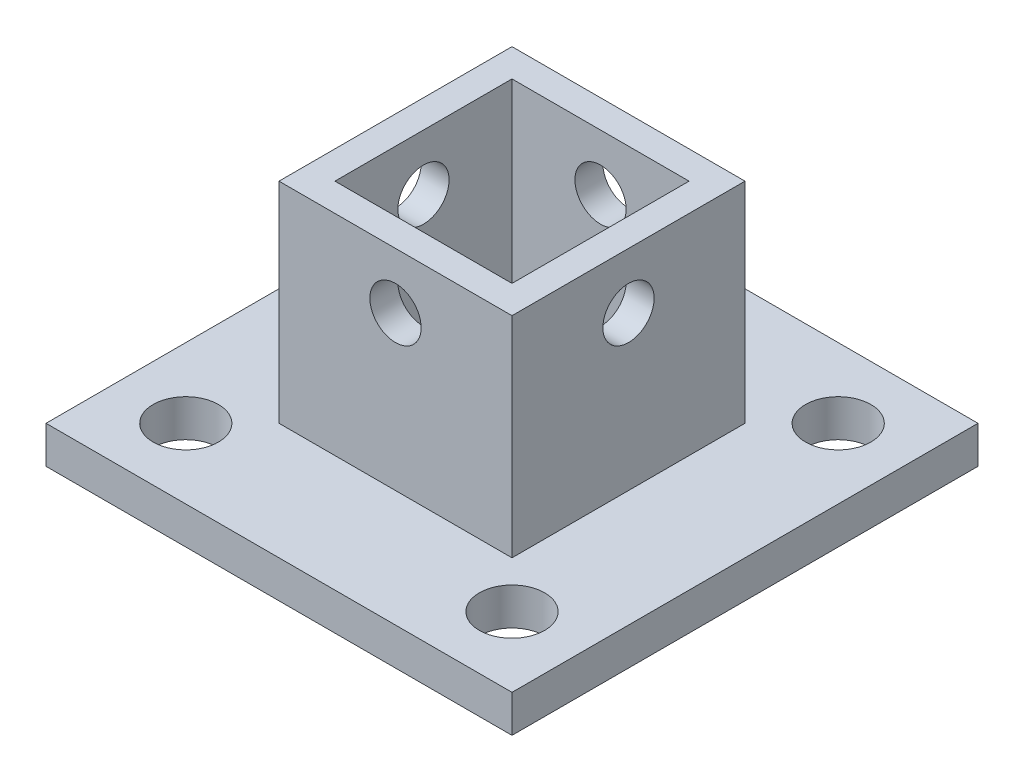
ISO-10303-21;
HEADER;
FILE_DESCRIPTION(('STEP AP214'),'2;1');
FILE_NAME('part.step','',(''),(''),'','','');
FILE_SCHEMA(('AUTOMOTIVE_DESIGN { 1 0 10303 214 1 1 1 1 }'));
ENDSEC;
DATA;
#1=APPLICATION_CONTEXT('core data for automotive mechanical design processes');
#2=APPLICATION_PROTOCOL_DEFINITION('international standard','automotive_design',2000,#1);
#3=PRODUCT_CONTEXT('',#1,'mechanical');
#4=PRODUCT('Part','Part','',(#3));
#5=PRODUCT_RELATED_PRODUCT_CATEGORY('part','',(#4));
#6=PRODUCT_DEFINITION_FORMATION('','',#4);
#7=PRODUCT_DEFINITION_CONTEXT('part definition',#1,'design');
#8=PRODUCT_DEFINITION('design','',#6,#7);
#9=PRODUCT_DEFINITION_SHAPE('','',#8);
#10=(LENGTH_UNIT() NAMED_UNIT(*) SI_UNIT(.MILLI.,.METRE.));
#11=(NAMED_UNIT(*) PLANE_ANGLE_UNIT() SI_UNIT($,.RADIAN.));
#12=(NAMED_UNIT(*) SI_UNIT($,.STERADIAN.) SOLID_ANGLE_UNIT());
#13=UNCERTAINTY_MEASURE_WITH_UNIT(LENGTH_MEASURE(1.E-05),#10,'distance_accuracy_value','');
#14=(GEOMETRIC_REPRESENTATION_CONTEXT(3) GLOBAL_UNCERTAINTY_ASSIGNED_CONTEXT((#13)) GLOBAL_UNIT_ASSIGNED_CONTEXT((#10,
#11,#12)) REPRESENTATION_CONTEXT('',''));
#15=CARTESIAN_POINT('',(0.,0.,0.));
#16=DIRECTION('',(0.,0.,1.));
#17=DIRECTION('',(1.,0.,0.));
#18=AXIS2_PLACEMENT_3D('',#15,#16,#17);
#19=CARTESIAN_POINT('',(0.,4.,0.));
#20=DIRECTION('',(0.,1.,0.));
#21=DIRECTION('',(0.,0.,1.));
#22=AXIS2_PLACEMENT_3D('',#19,#20,#21);
#23=PLANE('',#22);
#24=DIRECTION('',(0.,0.,1.));
#25=VECTOR('',#24,1.);
#26=CARTESIAN_POINT('',(25.,4.,0.));
#27=LINE('',#26,#25);
#28=CARTESIAN_POINT('',(25.,4.,-25.));
#29=VERTEX_POINT('',#28);
#30=CARTESIAN_POINT('',(25.,4.,25.));
#31=VERTEX_POINT('',#30);
#32=EDGE_CURVE('E214',#29,#31,#27,.T.);
#33=ORIENTED_EDGE('',*,*,#32,.F.);
#34=DIRECTION('',(1.,0.,0.));
#35=VECTOR('',#34,1.);
#36=CARTESIAN_POINT('',(0.,4.,-25.));
#37=LINE('',#36,#35);
#38=CARTESIAN_POINT('',(-25.,4.,-25.));
#39=VERTEX_POINT('',#38);
#40=EDGE_CURVE('E217',#39,#29,#37,.T.);
#41=ORIENTED_EDGE('',*,*,#40,.F.);
#42=DIRECTION('',(0.,0.,1.));
#43=VECTOR('',#42,1.);
#44=CARTESIAN_POINT('',(-25.,4.,0.));
#45=LINE('',#44,#43);
#46=CARTESIAN_POINT('',(-25.,4.,25.));
#47=VERTEX_POINT('',#46);
#48=EDGE_CURVE('E220',#39,#47,#45,.T.);
#49=ORIENTED_EDGE('',*,*,#48,.T.);
#50=DIRECTION('',(1.,0.,0.));
#51=VECTOR('',#50,1.);
#52=CARTESIAN_POINT('',(0.,4.,25.));
#53=LINE('',#52,#51);
#54=EDGE_CURVE('E223',#47,#31,#53,.T.);
#55=ORIENTED_EDGE('',*,*,#54,.T.);
#56=EDGE_LOOP('',(#33,#41,#49,#55));
#57=FACE_BOUND('',#56,.T.);
#58=CARTESIAN_POINT('',(-17.5,4.,-17.5));
#59=DIRECTION('',(0.,1.,0.));
#60=DIRECTION('',(0.,0.,1.));
#61=AXIS2_PLACEMENT_3D('',#58,#59,#60);
#62=CIRCLE('',#61,3.5);
#63=CARTESIAN_POINT('',(-17.5,4.,-14.));
#64=VERTEX_POINT('',#63);
#65=EDGE_CURVE('E211',#64,#64,#62,.T.);
#66=ORIENTED_EDGE('',*,*,#65,.F.);
#67=EDGE_LOOP('',(#66));
#68=FACE_BOUND('',#67,.T.);
#69=CARTESIAN_POINT('',(17.5,4.,-17.5));
#70=DIRECTION('',(0.,1.,0.));
#71=DIRECTION('',(0.,0.,1.));
#72=AXIS2_PLACEMENT_3D('',#69,#70,#71);
#73=CIRCLE('',#72,3.5);
#74=CARTESIAN_POINT('',(17.5,4.,-14.));
#75=VERTEX_POINT('',#74);
#76=EDGE_CURVE('E208',#75,#75,#73,.T.);
#77=ORIENTED_EDGE('',*,*,#76,.F.);
#78=EDGE_LOOP('',(#77));
#79=FACE_BOUND('',#78,.T.);
#80=CARTESIAN_POINT('',(17.5000000000004,4.,17.5));
#81=DIRECTION('',(0.,1.,0.));
#82=DIRECTION('',(0.,0.,1.));
#83=AXIS2_PLACEMENT_3D('',#80,#81,#82);
#84=CIRCLE('',#83,3.5);
#85=CARTESIAN_POINT('',(17.5000000000004,4.,21.));
#86=VERTEX_POINT('',#85);
#87=EDGE_CURVE('E204',#86,#86,#84,.T.);
#88=ORIENTED_EDGE('',*,*,#87,.F.);
#89=EDGE_LOOP('',(#88));
#90=FACE_BOUND('',#89,.T.);
#91=CARTESIAN_POINT('',(-17.4999999999996,4.,17.5));
#92=DIRECTION('',(0.,1.,0.));
#93=DIRECTION('',(0.,0.,1.));
#94=AXIS2_PLACEMENT_3D('',#91,#92,#93);
#95=CIRCLE('',#94,3.5);
#96=CARTESIAN_POINT('',(-17.4999999999996,4.,21.));
#97=VERTEX_POINT('',#96);
#98=EDGE_CURVE('E201',#97,#97,#95,.T.);
#99=ORIENTED_EDGE('',*,*,#98,.F.);
#100=EDGE_LOOP('',(#99));
#101=FACE_BOUND('',#100,.T.);
#102=DIRECTION('',(1.,0.,0.));
#103=VECTOR('',#102,1.);
#104=CARTESIAN_POINT('',(-12.5,4.,12.5));
#105=LINE('',#104,#103);
#106=CARTESIAN_POINT('',(-12.5,4.,12.5));
#107=VERTEX_POINT('',#106);
#108=CARTESIAN_POINT('',(12.5,4.,12.5));
#109=VERTEX_POINT('',#108);
#110=EDGE_CURVE('E187',#107,#109,#105,.T.);
#111=ORIENTED_EDGE('',*,*,#110,.F.);
#112=DIRECTION('',(0.,0.,1.));
#113=VECTOR('',#112,1.);
#114=CARTESIAN_POINT('',(-12.5,4.,-12.5));
#115=LINE('',#114,#113);
#116=CARTESIAN_POINT('',(-12.5,4.,-12.5));
#117=VERTEX_POINT('',#116);
#118=EDGE_CURVE('E150',#117,#107,#115,.T.);
#119=ORIENTED_EDGE('',*,*,#118,.F.);
#120=DIRECTION('',(-1.,0.,0.));
#121=VECTOR('',#120,1.);
#122=CARTESIAN_POINT('',(-12.5,4.,-12.5));
#123=LINE('',#122,#121);
#124=CARTESIAN_POINT('',(12.5,4.,-12.5));
#125=VERTEX_POINT('',#124);
#126=EDGE_CURVE('E178',#125,#117,#123,.T.);
#127=ORIENTED_EDGE('',*,*,#126,.F.);
#128=DIRECTION('',(0.,0.,-1.));
#129=VECTOR('',#128,1.);
#130=CARTESIAN_POINT('',(12.5,4.,-12.5));
#131=LINE('',#130,#129);
#132=EDGE_CURVE('E189',#109,#125,#131,.T.);
#133=ORIENTED_EDGE('',*,*,#132,.F.);
#134=EDGE_LOOP('',(#111,#119,#127,#133));
#135=FACE_BOUND('',#134,.T.);
#136=ADVANCED_FACE('F41',(#57,#68,#79,#90,#101,#135),#23,.T.);
#137=CARTESIAN_POINT('',(25.,4.,0.));
#138=DIRECTION('',(1.,0.,0.));
#139=DIRECTION('',(0.,0.,-1.));
#140=AXIS2_PLACEMENT_3D('',#137,#138,#139);
#141=PLANE('',#140);
#142=DIRECTION('',(0.,0.,1.));
#143=VECTOR('',#142,1.);
#144=CARTESIAN_POINT('',(25.,0.,0.));
#145=LINE('',#144,#143);
#146=CARTESIAN_POINT('',(25.,0.,-25.));
#147=VERTEX_POINT('',#146);
#148=CARTESIAN_POINT('',(25.,0.,25.));
#149=VERTEX_POINT('',#148);
#150=EDGE_CURVE('E237',#147,#149,#145,.T.);
#151=ORIENTED_EDGE('',*,*,#150,.F.);
#152=DIRECTION('',(0.,-1.,0.));
#153=VECTOR('',#152,1.);
#154=CARTESIAN_POINT('',(25.,4.,-25.));
#155=LINE('',#154,#153);
#156=EDGE_CURVE('E11',#29,#147,#155,.T.);
#157=ORIENTED_EDGE('',*,*,#156,.F.);
#158=ORIENTED_EDGE('',*,*,#32,.T.);
#159=DIRECTION('',(0.,-1.,0.));
#160=VECTOR('',#159,1.);
#161=CARTESIAN_POINT('',(25.,4.,25.));
#162=LINE('',#161,#160);
#163=EDGE_CURVE('E225',#31,#149,#162,.T.);
#164=ORIENTED_EDGE('',*,*,#163,.T.);
#165=EDGE_LOOP('',(#151,#157,#158,#164));
#166=FACE_BOUND('',#165,.T.);
#167=ADVANCED_FACE('F295',(#166),#141,.T.);
#168=CARTESIAN_POINT('',(0.,4.,-25.));
#169=DIRECTION('',(0.,0.,-1.));
#170=DIRECTION('',(-1.,0.,0.));
#171=AXIS2_PLACEMENT_3D('',#168,#169,#170);
#172=PLANE('',#171);
#173=DIRECTION('',(1.,0.,0.));
#174=VECTOR('',#173,1.);
#175=CARTESIAN_POINT('',(0.,0.,-25.));
#176=LINE('',#175,#174);
#177=CARTESIAN_POINT('',(-25.,0.,-25.));
#178=VERTEX_POINT('',#177);
#179=EDGE_CURVE('E240',#178,#147,#176,.T.);
#180=ORIENTED_EDGE('',*,*,#179,.F.);
#181=DIRECTION('',(0.,-1.,0.));
#182=VECTOR('',#181,1.);
#183=CARTESIAN_POINT('',(-25.,4.,-25.));
#184=LINE('',#183,#182);
#185=EDGE_CURVE('E50',#39,#178,#184,.T.);
#186=ORIENTED_EDGE('',*,*,#185,.F.);
#187=ORIENTED_EDGE('',*,*,#40,.T.);
#188=ORIENTED_EDGE('',*,*,#156,.T.);
#189=EDGE_LOOP('',(#180,#186,#187,#188));
#190=FACE_BOUND('',#189,.T.);
#191=ADVANCED_FACE('F303',(#190),#172,.T.);
#192=CARTESIAN_POINT('',(-25.,4.,0.));
#193=DIRECTION('',(1.,0.,0.));
#194=DIRECTION('',(0.,0.,-1.));
#195=AXIS2_PLACEMENT_3D('',#192,#193,#194);
#196=PLANE('',#195);
#197=DIRECTION('',(0.,0.,1.));
#198=VECTOR('',#197,1.);
#199=CARTESIAN_POINT('',(-25.,0.,0.));
#200=LINE('',#199,#198);
#201=CARTESIAN_POINT('',(-25.,0.,25.));
#202=VERTEX_POINT('',#201);
#203=EDGE_CURVE('E243',#178,#202,#200,.T.);
#204=ORIENTED_EDGE('',*,*,#203,.T.);
#205=DIRECTION('',(0.,-1.,0.));
#206=VECTOR('',#205,1.);
#207=CARTESIAN_POINT('',(-25.,4.,25.));
#208=LINE('',#207,#206);
#209=EDGE_CURVE('E249',#47,#202,#208,.T.);
#210=ORIENTED_EDGE('',*,*,#209,.F.);
#211=ORIENTED_EDGE('',*,*,#48,.F.);
#212=ORIENTED_EDGE('',*,*,#185,.T.);
#213=EDGE_LOOP('',(#204,#210,#211,#212));
#214=FACE_BOUND('',#213,.T.);
#215=ADVANCED_FACE('F487',(#214),#196,.F.);
#216=CARTESIAN_POINT('',(-17.5,4.,-17.5));
#217=DIRECTION('',(0.,-1.,0.));
#218=DIRECTION('',(0.,0.,-1.));
#219=AXIS2_PLACEMENT_3D('',#216,#217,#218);
#220=CYLINDRICAL_SURFACE('',#219,3.5);
#221=ORIENTED_EDGE('',*,*,#65,.T.);
#222=EDGE_LOOP('',(#221));
#223=FACE_BOUND('',#222,.T.);
#224=CARTESIAN_POINT('',(-17.5,0.,-17.5));
#225=DIRECTION('',(0.,1.,0.));
#226=DIRECTION('',(0.,0.,1.));
#227=AXIS2_PLACEMENT_3D('',#224,#225,#226);
#228=CIRCLE('',#227,3.5);
#229=CARTESIAN_POINT('',(-17.5,0.,-14.));
#230=VERTEX_POINT('',#229);
#231=EDGE_CURVE('E234',#230,#230,#228,.T.);
#232=ORIENTED_EDGE('',*,*,#231,.F.);
#233=EDGE_LOOP('',(#232));
#234=FACE_BOUND('',#233,.T.);
#235=ADVANCED_FACE('F478',(#223,#234),#220,.F.);
#236=CARTESIAN_POINT('',(17.5,4.,-17.5));
#237=DIRECTION('',(0.,-1.,0.));
#238=DIRECTION('',(0.,0.,-1.));
#239=AXIS2_PLACEMENT_3D('',#236,#237,#238);
#240=CYLINDRICAL_SURFACE('',#239,3.5);
#241=ORIENTED_EDGE('',*,*,#76,.T.);
#242=EDGE_LOOP('',(#241));
#243=FACE_BOUND('',#242,.T.);
#244=CARTESIAN_POINT('',(17.5,0.,-17.5));
#245=DIRECTION('',(0.,1.,0.));
#246=DIRECTION('',(0.,0.,1.));
#247=AXIS2_PLACEMENT_3D('',#244,#245,#246);
#248=CIRCLE('',#247,3.5);
#249=CARTESIAN_POINT('',(17.5,0.,-14.));
#250=VERTEX_POINT('',#249);
#251=EDGE_CURVE('E231',#250,#250,#248,.T.);
#252=ORIENTED_EDGE('',*,*,#251,.F.);
#253=EDGE_LOOP('',(#252));
#254=FACE_BOUND('',#253,.T.);
#255=ADVANCED_FACE('F470',(#243,#254),#240,.F.);
#256=CARTESIAN_POINT('',(17.5000000000004,4.,17.5));
#257=DIRECTION('',(0.,-1.,0.));
#258=DIRECTION('',(0.,0.,-1.));
#259=AXIS2_PLACEMENT_3D('',#256,#257,#258);
#260=CYLINDRICAL_SURFACE('',#259,3.5);
#261=ORIENTED_EDGE('',*,*,#87,.T.);
#262=EDGE_LOOP('',(#261));
#263=FACE_BOUND('',#262,.T.);
#264=CARTESIAN_POINT('',(17.5000000000004,0.,17.5));
#265=DIRECTION('',(0.,1.,0.));
#266=DIRECTION('',(0.,0.,1.));
#267=AXIS2_PLACEMENT_3D('',#264,#265,#266);
#268=CIRCLE('',#267,3.5);
#269=CARTESIAN_POINT('',(17.5000000000004,0.,21.));
#270=VERTEX_POINT('',#269);
#271=EDGE_CURVE('E228',#270,#270,#268,.T.);
#272=ORIENTED_EDGE('',*,*,#271,.F.);
#273=EDGE_LOOP('',(#272));
#274=FACE_BOUND('',#273,.T.);
#275=ADVANCED_FACE('F462',(#263,#274),#260,.F.);
#276=CARTESIAN_POINT('',(-17.4999999999996,4.,17.5));
#277=DIRECTION('',(0.,-1.,0.));
#278=DIRECTION('',(0.,0.,-1.));
#279=AXIS2_PLACEMENT_3D('',#276,#277,#278);
#280=CYLINDRICAL_SURFACE('',#279,3.5);
#281=ORIENTED_EDGE('',*,*,#98,.T.);
#282=EDGE_LOOP('',(#281));
#283=FACE_BOUND('',#282,.T.);
#284=CARTESIAN_POINT('',(-17.4999999999996,0.,17.5));
#285=DIRECTION('',(0.,1.,0.));
#286=DIRECTION('',(0.,0.,1.));
#287=AXIS2_PLACEMENT_3D('',#284,#285,#286);
#288=CIRCLE('',#287,3.5);
#289=CARTESIAN_POINT('',(-17.4999999999996,0.,21.));
#290=VERTEX_POINT('',#289);
#291=EDGE_CURVE('E200',#290,#290,#288,.T.);
#292=ORIENTED_EDGE('',*,*,#291,.F.);
#293=EDGE_LOOP('',(#292));
#294=FACE_BOUND('',#293,.T.);
#295=ADVANCED_FACE('F43',(#283,#294),#280,.F.);
#296=CARTESIAN_POINT('',(0.,4.,25.));
#297=DIRECTION('',(0.,0.,-1.));
#298=DIRECTION('',(-1.,0.,0.));
#299=AXIS2_PLACEMENT_3D('',#296,#297,#298);
#300=PLANE('',#299);
#301=DIRECTION('',(1.,0.,0.));
#302=VECTOR('',#301,1.);
#303=CARTESIAN_POINT('',(0.,0.,25.));
#304=LINE('',#303,#302);
#305=EDGE_CURVE('E205',#202,#149,#304,.T.);
#306=ORIENTED_EDGE('',*,*,#305,.T.);
#307=ORIENTED_EDGE('',*,*,#163,.F.);
#308=ORIENTED_EDGE('',*,*,#54,.F.);
#309=ORIENTED_EDGE('',*,*,#209,.T.);
#310=EDGE_LOOP('',(#306,#307,#308,#309));
#311=FACE_BOUND('',#310,.T.);
#312=ADVANCED_FACE('F442',(#311),#300,.F.);
#313=CARTESIAN_POINT('',(0.,0.,0.));
#314=DIRECTION('',(0.,1.,0.));
#315=DIRECTION('',(0.,0.,1.));
#316=AXIS2_PLACEMENT_3D('',#313,#314,#315);
#317=PLANE('',#316);
#318=ORIENTED_EDGE('',*,*,#291,.T.);
#319=EDGE_LOOP('',(#318));
#320=FACE_BOUND('',#319,.T.);
#321=ORIENTED_EDGE('',*,*,#271,.T.);
#322=EDGE_LOOP('',(#321));
#323=FACE_BOUND('',#322,.T.);
#324=ORIENTED_EDGE('',*,*,#251,.T.);
#325=EDGE_LOOP('',(#324));
#326=FACE_BOUND('',#325,.T.);
#327=ORIENTED_EDGE('',*,*,#231,.T.);
#328=EDGE_LOOP('',(#327));
#329=FACE_BOUND('',#328,.T.);
#330=ORIENTED_EDGE('',*,*,#150,.T.);
#331=ORIENTED_EDGE('',*,*,#305,.F.);
#332=ORIENTED_EDGE('',*,*,#203,.F.);
#333=ORIENTED_EDGE('',*,*,#179,.T.);
#334=EDGE_LOOP('',(#330,#331,#332,#333));
#335=FACE_BOUND('',#334,.T.);
#336=ADVANCED_FACE('F334',(#320,#323,#326,#329,#335),#317,.F.);
#337=CARTESIAN_POINT('',(0.,26.5,0.));
#338=DIRECTION('',(0.,1.,0.));
#339=DIRECTION('',(0.,0.,1.));
#340=AXIS2_PLACEMENT_3D('',#337,#338,#339);
#341=PLANE('',#340);
#342=DIRECTION('',(0.,0.,1.));
#343=VECTOR('',#342,1.);
#344=CARTESIAN_POINT('',(-12.5,26.5,-12.5));
#345=LINE('',#344,#343);
#346=CARTESIAN_POINT('',(-12.5,26.5,-12.5));
#347=VERTEX_POINT('',#346);
#348=CARTESIAN_POINT('',(-12.5,26.5,12.5));
#349=VERTEX_POINT('',#348);
#350=EDGE_CURVE('E174',#347,#349,#345,.T.);
#351=ORIENTED_EDGE('',*,*,#350,.T.);
#352=DIRECTION('',(1.,0.,0.));
#353=VECTOR('',#352,1.);
#354=CARTESIAN_POINT('',(-12.5,26.5,12.5));
#355=LINE('',#354,#353);
#356=CARTESIAN_POINT('',(12.5,26.5,12.5));
#357=VERTEX_POINT('',#356);
#358=EDGE_CURVE('E177',#349,#357,#355,.T.);
#359=ORIENTED_EDGE('',*,*,#358,.T.);
#360=DIRECTION('',(0.,0.,-1.));
#361=VECTOR('',#360,1.);
#362=CARTESIAN_POINT('',(12.5,26.5,-12.5));
#363=LINE('',#362,#361);
#364=CARTESIAN_POINT('',(12.5,26.5,-12.5));
#365=VERTEX_POINT('',#364);
#366=EDGE_CURVE('E180',#357,#365,#363,.T.);
#367=ORIENTED_EDGE('',*,*,#366,.T.);
#368=DIRECTION('',(-1.,0.,0.));
#369=VECTOR('',#368,1.);
#370=CARTESIAN_POINT('',(-12.5,26.5,-12.5));
#371=LINE('',#370,#369);
#372=EDGE_CURVE('E182',#365,#347,#371,.T.);
#373=ORIENTED_EDGE('',*,*,#372,.T.);
#374=EDGE_LOOP('',(#351,#359,#367,#373));
#375=FACE_BOUND('',#374,.T.);
#376=DIRECTION('',(1.,0.,0.));
#377=VECTOR('',#376,1.);
#378=CARTESIAN_POINT('',(-9.5,26.5,9.5));
#379=LINE('',#378,#377);
#380=CARTESIAN_POINT('',(-9.5,26.5,9.5));
#381=VERTEX_POINT('',#380);
#382=CARTESIAN_POINT('',(9.50000000000001,26.5,9.5));
#383=VERTEX_POINT('',#382);
#384=EDGE_CURVE('E142',#381,#383,#379,.T.);
#385=ORIENTED_EDGE('',*,*,#384,.F.);
#386=DIRECTION('',(0.,0.,1.));
#387=VECTOR('',#386,1.);
#388=CARTESIAN_POINT('',(-9.5,26.5,-9.5));
#389=LINE('',#388,#387);
#390=CARTESIAN_POINT('',(-9.5,26.5,-9.5));
#391=VERTEX_POINT('',#390);
#392=EDGE_CURVE('E133',#391,#381,#389,.T.);
#393=ORIENTED_EDGE('',*,*,#392,.F.);
#394=DIRECTION('',(-1.,0.,0.));
#395=VECTOR('',#394,1.);
#396=CARTESIAN_POINT('',(-9.5,26.5,-9.5));
#397=LINE('',#396,#395);
#398=CARTESIAN_POINT('',(9.5,26.5,-9.5));
#399=VERTEX_POINT('',#398);
#400=EDGE_CURVE('E158',#399,#391,#397,.T.);
#401=ORIENTED_EDGE('',*,*,#400,.F.);
#402=DIRECTION('',(0.,0.,-1.));
#403=VECTOR('',#402,1.);
#404=CARTESIAN_POINT('',(9.5,26.5,-9.5));
#405=LINE('',#404,#403);
#406=EDGE_CURVE('E156',#383,#399,#405,.T.);
#407=ORIENTED_EDGE('',*,*,#406,.F.);
#408=EDGE_LOOP('',(#385,#393,#401,#407));
#409=FACE_BOUND('',#408,.T.);
#410=ADVANCED_FACE('F154',(#375,#409),#341,.T.);
#411=CARTESIAN_POINT('',(-12.5,26.5,-12.5));
#412=DIRECTION('',(1.,0.,0.));
#413=DIRECTION('',(0.,0.,-1.));
#414=AXIS2_PLACEMENT_3D('',#411,#412,#413);
#415=PLANE('',#414);
#416=CARTESIAN_POINT('',(-12.5,20.5,0.));
#417=DIRECTION('',(1.,0.,0.));
#418=DIRECTION('',(0.,0.,-1.));
#419=AXIS2_PLACEMENT_3D('',#416,#417,#418);
#420=CIRCLE('',#419,2.75);
#421=CARTESIAN_POINT('',(-12.5,20.5,2.75));
#422=VERTEX_POINT('',#421);
#423=EDGE_CURVE('E164',#422,#422,#420,.T.);
#424=ORIENTED_EDGE('',*,*,#423,.T.);
#425=EDGE_LOOP('',(#424));
#426=FACE_BOUND('',#425,.T.);
#427=ORIENTED_EDGE('',*,*,#118,.T.);
#428=DIRECTION('',(0.,-1.,0.));
#429=VECTOR('',#428,1.);
#430=CARTESIAN_POINT('',(-12.5,26.5,12.5));
#431=LINE('',#430,#429);
#432=EDGE_CURVE('E198',#349,#107,#431,.T.);
#433=ORIENTED_EDGE('',*,*,#432,.F.);
#434=ORIENTED_EDGE('',*,*,#350,.F.);
#435=DIRECTION('',(0.,-1.,0.));
#436=VECTOR('',#435,1.);
#437=CARTESIAN_POINT('',(-12.5,26.5,-12.5));
#438=LINE('',#437,#436);
#439=EDGE_CURVE('E184',#347,#117,#438,.T.);
#440=ORIENTED_EDGE('',*,*,#439,.T.);
#441=EDGE_LOOP('',(#427,#433,#434,#440));
#442=FACE_BOUND('',#441,.T.);
#443=ADVANCED_FACE('F275',(#426,#442),#415,.F.);
#444=CARTESIAN_POINT('',(-12.5,26.5,12.5));
#445=DIRECTION('',(0.,0.,-1.));
#446=DIRECTION('',(-1.,0.,0.));
#447=AXIS2_PLACEMENT_3D('',#444,#445,#446);
#448=PLANE('',#447);
#449=CARTESIAN_POINT('',(0.,20.5,12.5));
#450=DIRECTION('',(0.,0.,-1.));
#451=DIRECTION('',(-1.,0.,0.));
#452=AXIS2_PLACEMENT_3D('',#449,#450,#451);
#453=CIRCLE('',#452,2.75);
#454=CARTESIAN_POINT('',(2.75,20.5,12.5));
#455=VERTEX_POINT('',#454);
#456=EDGE_CURVE('E255',#455,#455,#453,.T.);
#457=ORIENTED_EDGE('',*,*,#456,.T.);
#458=EDGE_LOOP('',(#457));
#459=FACE_BOUND('',#458,.T.);
#460=ORIENTED_EDGE('',*,*,#110,.T.);
#461=DIRECTION('',(0.,-1.,0.));
#462=VECTOR('',#461,1.);
#463=CARTESIAN_POINT('',(12.5,26.5,12.5));
#464=LINE('',#463,#462);
#465=EDGE_CURVE('E195',#357,#109,#464,.T.);
#466=ORIENTED_EDGE('',*,*,#465,.F.);
#467=ORIENTED_EDGE('',*,*,#358,.F.);
#468=ORIENTED_EDGE('',*,*,#432,.T.);
#469=EDGE_LOOP('',(#460,#466,#467,#468));
#470=FACE_BOUND('',#469,.T.);
#471=ADVANCED_FACE('F342',(#459,#470),#448,.F.);
#472=CARTESIAN_POINT('',(12.5,26.5,-12.5));
#473=DIRECTION('',(-1.,0.,0.));
#474=DIRECTION('',(0.,0.,1.));
#475=AXIS2_PLACEMENT_3D('',#472,#473,#474);
#476=PLANE('',#475);
#477=CARTESIAN_POINT('',(12.5,20.5,0.));
#478=DIRECTION('',(-1.,0.,0.));
#479=DIRECTION('',(0.,0.,1.));
#480=AXIS2_PLACEMENT_3D('',#477,#478,#479);
#481=CIRCLE('',#480,2.75);
#482=CARTESIAN_POINT('',(12.5,20.5,2.75));
#483=VERTEX_POINT('',#482);
#484=EDGE_CURVE('E259',#483,#483,#481,.T.);
#485=ORIENTED_EDGE('',*,*,#484,.T.);
#486=EDGE_LOOP('',(#485));
#487=FACE_BOUND('',#486,.T.);
#488=ORIENTED_EDGE('',*,*,#132,.T.);
#489=DIRECTION('',(0.,-1.,0.));
#490=VECTOR('',#489,1.);
#491=CARTESIAN_POINT('',(12.5,26.5,-12.5));
#492=LINE('',#491,#490);
#493=EDGE_CURVE('E58',#365,#125,#492,.T.);
#494=ORIENTED_EDGE('',*,*,#493,.F.);
#495=ORIENTED_EDGE('',*,*,#366,.F.);
#496=ORIENTED_EDGE('',*,*,#465,.T.);
#497=EDGE_LOOP('',(#488,#494,#495,#496));
#498=FACE_BOUND('',#497,.T.);
#499=ADVANCED_FACE('F338',(#487,#498),#476,.F.);
#500=CARTESIAN_POINT('',(-12.5,26.5,-12.5));
#501=DIRECTION('',(0.,0.,1.));
#502=DIRECTION('',(1.,0.,0.));
#503=AXIS2_PLACEMENT_3D('',#500,#501,#502);
#504=PLANE('',#503);
#505=CARTESIAN_POINT('',(0.,20.5,-12.5));
#506=DIRECTION('',(0.,0.,1.));
#507=DIRECTION('',(1.,0.,0.));
#508=AXIS2_PLACEMENT_3D('',#505,#506,#507);
#509=CIRCLE('',#508,2.75);
#510=CARTESIAN_POINT('',(2.75,20.5,-12.5));
#511=VERTEX_POINT('',#510);
#512=EDGE_CURVE('E262',#511,#511,#509,.T.);
#513=ORIENTED_EDGE('',*,*,#512,.T.);
#514=EDGE_LOOP('',(#513));
#515=FACE_BOUND('',#514,.T.);
#516=ORIENTED_EDGE('',*,*,#126,.T.);
#517=ORIENTED_EDGE('',*,*,#439,.F.);
#518=ORIENTED_EDGE('',*,*,#372,.F.);
#519=ORIENTED_EDGE('',*,*,#493,.T.);
#520=EDGE_LOOP('',(#516,#517,#518,#519));
#521=FACE_BOUND('',#520,.T.);
#522=ADVANCED_FACE('F331',(#515,#521),#504,.F.);
#523=CARTESIAN_POINT('',(-9.5,26.5,-9.5));
#524=DIRECTION('',(1.,0.,0.));
#525=DIRECTION('',(0.,0.,-1.));
#526=AXIS2_PLACEMENT_3D('',#523,#524,#525);
#527=PLANE('',#526);
#528=CARTESIAN_POINT('',(-9.5,20.5,0.));
#529=DIRECTION('',(1.,0.,0.));
#530=DIRECTION('',(0.,0.,-1.));
#531=AXIS2_PLACEMENT_3D('',#528,#529,#530);
#532=CIRCLE('',#531,2.75);
#533=CARTESIAN_POINT('',(-9.5,20.5,2.75));
#534=VERTEX_POINT('',#533);
#535=EDGE_CURVE('E254',#534,#534,#532,.T.);
#536=ORIENTED_EDGE('',*,*,#535,.F.);
#537=EDGE_LOOP('',(#536));
#538=FACE_BOUND('',#537,.T.);
#539=DIRECTION('',(0.,0.,1.));
#540=VECTOR('',#539,1.);
#541=CARTESIAN_POINT('',(-9.5,4.,-9.5));
#542=LINE('',#541,#540);
#543=CARTESIAN_POINT('',(-9.5,4.,-9.5));
#544=VERTEX_POINT('',#543);
#545=CARTESIAN_POINT('',(-9.5,4.,9.5));
#546=VERTEX_POINT('',#545);
#547=EDGE_CURVE('E66',#544,#546,#542,.T.);
#548=ORIENTED_EDGE('',*,*,#547,.F.);
#549=DIRECTION('',(0.,-1.,0.));
#550=VECTOR('',#549,1.);
#551=CARTESIAN_POINT('',(-9.5,26.5,-9.5));
#552=LINE('',#551,#550);
#553=EDGE_CURVE('E138',#391,#544,#552,.T.);
#554=ORIENTED_EDGE('',*,*,#553,.F.);
#555=ORIENTED_EDGE('',*,*,#392,.T.);
#556=DIRECTION('',(0.,-1.,0.));
#557=VECTOR('',#556,1.);
#558=CARTESIAN_POINT('',(-9.5,26.5,9.5));
#559=LINE('',#558,#557);
#560=EDGE_CURVE('E136',#381,#546,#559,.T.);
#561=ORIENTED_EDGE('',*,*,#560,.T.);
#562=EDGE_LOOP('',(#548,#554,#555,#561));
#563=FACE_BOUND('',#562,.T.);
#564=ADVANCED_FACE('F135',(#538,#563),#527,.T.);
#565=CARTESIAN_POINT('',(-9.5,26.5,9.5));
#566=DIRECTION('',(0.,0.,-1.));
#567=DIRECTION('',(-1.,0.,0.));
#568=AXIS2_PLACEMENT_3D('',#565,#566,#567);
#569=PLANE('',#568);
#570=CARTESIAN_POINT('',(0.,20.5,9.5));
#571=DIRECTION('',(0.,0.,-1.));
#572=DIRECTION('',(-1.,0.,0.));
#573=AXIS2_PLACEMENT_3D('',#570,#571,#572);
#574=CIRCLE('',#573,2.75);
#575=CARTESIAN_POINT('',(2.75,20.5,9.5));
#576=VERTEX_POINT('',#575);
#577=EDGE_CURVE('E267',#576,#576,#574,.T.);
#578=ORIENTED_EDGE('',*,*,#577,.F.);
#579=EDGE_LOOP('',(#578));
#580=FACE_BOUND('',#579,.T.);
#581=DIRECTION('',(1.,0.,0.));
#582=VECTOR('',#581,1.);
#583=CARTESIAN_POINT('',(-9.5,4.,9.5));
#584=LINE('',#583,#582);
#585=CARTESIAN_POINT('',(9.50000000000001,4.,9.5));
#586=VERTEX_POINT('',#585);
#587=EDGE_CURVE('E149',#546,#586,#584,.T.);
#588=ORIENTED_EDGE('',*,*,#587,.F.);
#589=ORIENTED_EDGE('',*,*,#560,.F.);
#590=ORIENTED_EDGE('',*,*,#384,.T.);
#591=DIRECTION('',(0.,-1.,0.));
#592=VECTOR('',#591,1.);
#593=CARTESIAN_POINT('',(9.50000000000001,26.5,9.5));
#594=LINE('',#593,#592);
#595=EDGE_CURVE('E151',#383,#586,#594,.T.);
#596=ORIENTED_EDGE('',*,*,#595,.T.);
#597=EDGE_LOOP('',(#588,#589,#590,#596));
#598=FACE_BOUND('',#597,.T.);
#599=ADVANCED_FACE('F146',(#580,#598),#569,.T.);
#600=CARTESIAN_POINT('',(9.5,26.5,-9.5));
#601=DIRECTION('',(-1.,0.,0.));
#602=DIRECTION('',(0.,0.,1.));
#603=AXIS2_PLACEMENT_3D('',#600,#601,#602);
#604=PLANE('',#603);
#605=CARTESIAN_POINT('',(9.50000000000001,20.5,0.));
#606=DIRECTION('',(-1.,0.,0.));
#607=DIRECTION('',(0.,0.,1.));
#608=AXIS2_PLACEMENT_3D('',#605,#606,#607);
#609=CIRCLE('',#608,2.75);
#610=CARTESIAN_POINT('',(9.50000000000001,20.5,2.75));
#611=VERTEX_POINT('',#610);
#612=EDGE_CURVE('E252',#611,#611,#609,.T.);
#613=ORIENTED_EDGE('',*,*,#612,.F.);
#614=EDGE_LOOP('',(#613));
#615=FACE_BOUND('',#614,.T.);
#616=DIRECTION('',(0.,0.,-1.));
#617=VECTOR('',#616,1.);
#618=CARTESIAN_POINT('',(9.5,4.,-9.5));
#619=LINE('',#618,#617);
#620=CARTESIAN_POINT('',(9.5,4.,-9.5));
#621=VERTEX_POINT('',#620);
#622=EDGE_CURVE('E166',#586,#621,#619,.T.);
#623=ORIENTED_EDGE('',*,*,#622,.F.);
#624=ORIENTED_EDGE('',*,*,#595,.F.);
#625=ORIENTED_EDGE('',*,*,#406,.T.);
#626=DIRECTION('',(0.,-1.,0.));
#627=VECTOR('',#626,1.);
#628=CARTESIAN_POINT('',(9.5,26.5,-9.5));
#629=LINE('',#628,#627);
#630=EDGE_CURVE('E170',#399,#621,#629,.T.);
#631=ORIENTED_EDGE('',*,*,#630,.T.);
#632=EDGE_LOOP('',(#623,#624,#625,#631));
#633=FACE_BOUND('',#632,.T.);
#634=ADVANCED_FACE('F316',(#615,#633),#604,.T.);
#635=CARTESIAN_POINT('',(-9.5,26.5,-9.5));
#636=DIRECTION('',(0.,0.,1.));
#637=DIRECTION('',(1.,0.,0.));
#638=AXIS2_PLACEMENT_3D('',#635,#636,#637);
#639=PLANE('',#638);
#640=CARTESIAN_POINT('',(0.,20.5,-9.5));
#641=DIRECTION('',(0.,0.,1.));
#642=DIRECTION('',(1.,0.,0.));
#643=AXIS2_PLACEMENT_3D('',#640,#641,#642);
#644=CIRCLE('',#643,2.75);
#645=CARTESIAN_POINT('',(2.75,20.5,-9.5));
#646=VERTEX_POINT('',#645);
#647=EDGE_CURVE('E45',#646,#646,#644,.T.);
#648=ORIENTED_EDGE('',*,*,#647,.F.);
#649=EDGE_LOOP('',(#648));
#650=FACE_BOUND('',#649,.T.);
#651=DIRECTION('',(-1.,0.,0.));
#652=VECTOR('',#651,1.);
#653=CARTESIAN_POINT('',(-9.5,4.,-9.5));
#654=LINE('',#653,#652);
#655=EDGE_CURVE('E143',#621,#544,#654,.T.);
#656=ORIENTED_EDGE('',*,*,#655,.F.);
#657=ORIENTED_EDGE('',*,*,#630,.F.);
#658=ORIENTED_EDGE('',*,*,#400,.T.);
#659=ORIENTED_EDGE('',*,*,#553,.T.);
#660=EDGE_LOOP('',(#656,#657,#658,#659));
#661=FACE_BOUND('',#660,.T.);
#662=ADVANCED_FACE('F311',(#650,#661),#639,.T.);
#663=ORIENTED_EDGE('',*,*,#547,.T.);
#664=ORIENTED_EDGE('',*,*,#587,.T.);
#665=ORIENTED_EDGE('',*,*,#622,.T.);
#666=ORIENTED_EDGE('',*,*,#655,.T.);
#667=EDGE_LOOP('',(#663,#664,#665,#666));
#668=FACE_BOUND('',#667,.T.);
#669=ADVANCED_FACE('F292',(#668),#23,.T.);
#670=CARTESIAN_POINT('',(25.,20.5,0.));
#671=DIRECTION('',(-1.,0.,0.));
#672=DIRECTION('',(0.,0.,1.));
#673=AXIS2_PLACEMENT_3D('',#670,#671,#672);
#674=CYLINDRICAL_SURFACE('',#673,2.75);
#675=CARTESIAN_POINT('',(9.50000000000001,20.5,2.75));
#676=CARTESIAN_POINT('',(9.53125000000001,20.5,2.75));
#677=CARTESIAN_POINT('',(9.56250000000001,20.5,2.75));
#678=CARTESIAN_POINT('',(9.62500000000001,20.5,2.75));
#679=CARTESIAN_POINT('',(9.65625000000001,20.5,2.75));
#680=CARTESIAN_POINT('',(9.71875000000001,20.5,2.75));
#681=CARTESIAN_POINT('',(9.75000000000001,20.5,2.75));
#682=CARTESIAN_POINT('',(9.81250000000001,20.5,2.75));
#683=CARTESIAN_POINT('',(9.84375000000001,20.5,2.75));
#684=CARTESIAN_POINT('',(9.90625000000001,20.5,2.75));
#685=CARTESIAN_POINT('',(9.93750000000001,20.5,2.75));
#686=CARTESIAN_POINT('',(10.,20.5,2.75));
#687=CARTESIAN_POINT('',(10.03125,20.5,2.75));
#688=CARTESIAN_POINT('',(10.09375,20.5,2.75));
#689=CARTESIAN_POINT('',(10.125,20.5,2.75));
#690=CARTESIAN_POINT('',(10.1875,20.5,2.75));
#691=CARTESIAN_POINT('',(10.21875,20.5,2.75));
#692=CARTESIAN_POINT('',(10.28125,20.5,2.75));
#693=CARTESIAN_POINT('',(10.3125,20.5,2.75));
#694=CARTESIAN_POINT('',(10.375,20.5,2.75));
#695=CARTESIAN_POINT('',(10.40625,20.5,2.75));
#696=CARTESIAN_POINT('',(10.46875,20.5,2.75));
#697=CARTESIAN_POINT('',(10.5,20.5,2.75));
#698=CARTESIAN_POINT('',(10.5625,20.5,2.75));
#699=CARTESIAN_POINT('',(10.59375,20.5,2.75));
#700=CARTESIAN_POINT('',(10.65625,20.5,2.75));
#701=CARTESIAN_POINT('',(10.6875,20.5,2.75));
#702=CARTESIAN_POINT('',(10.75,20.5,2.75));
#703=CARTESIAN_POINT('',(10.78125,20.5,2.75));
#704=CARTESIAN_POINT('',(10.84375,20.5,2.75));
#705=CARTESIAN_POINT('',(10.875,20.5,2.75));
#706=CARTESIAN_POINT('',(10.9375,20.5,2.75));
#707=CARTESIAN_POINT('',(10.96875,20.5,2.75));
#708=CARTESIAN_POINT('',(11.03125,20.5,2.75));
#709=CARTESIAN_POINT('',(11.0625,20.5,2.75));
#710=CARTESIAN_POINT('',(11.125,20.5,2.75));
#711=CARTESIAN_POINT('',(11.15625,20.5,2.75));
#712=CARTESIAN_POINT('',(11.21875,20.5,2.75));
#713=CARTESIAN_POINT('',(11.25,20.5,2.75));
#714=CARTESIAN_POINT('',(11.3125,20.5,2.75));
#715=CARTESIAN_POINT('',(11.34375,20.5,2.75));
#716=CARTESIAN_POINT('',(11.40625,20.5,2.75));
#717=CARTESIAN_POINT('',(11.4375,20.5,2.75));
#718=CARTESIAN_POINT('',(11.5,20.5,2.75));
#719=CARTESIAN_POINT('',(11.53125,20.5,2.75));
#720=CARTESIAN_POINT('',(11.59375,20.5,2.75));
#721=CARTESIAN_POINT('',(11.625,20.5,2.75));
#722=CARTESIAN_POINT('',(11.6875,20.5,2.75));
#723=CARTESIAN_POINT('',(11.71875,20.5,2.75));
#724=CARTESIAN_POINT('',(11.78125,20.5,2.75));
#725=CARTESIAN_POINT('',(11.8125,20.5,2.75));
#726=CARTESIAN_POINT('',(11.875,20.5,2.75));
#727=CARTESIAN_POINT('',(11.90625,20.5,2.75));
#728=CARTESIAN_POINT('',(11.96875,20.5,2.75));
#729=CARTESIAN_POINT('',(12.,20.5,2.75));
#730=CARTESIAN_POINT('',(12.0625,20.5,2.75));
#731=CARTESIAN_POINT('',(12.09375,20.5,2.75));
#732=CARTESIAN_POINT('',(12.15625,20.5,2.75));
#733=CARTESIAN_POINT('',(12.1875,20.5,2.75));
#734=CARTESIAN_POINT('',(12.25,20.5,2.75));
#735=CARTESIAN_POINT('',(12.28125,20.5,2.75));
#736=CARTESIAN_POINT('',(12.34375,20.5,2.75));
#737=CARTESIAN_POINT('',(12.375,20.5,2.75));
#738=CARTESIAN_POINT('',(12.4375,20.5,2.75));
#739=CARTESIAN_POINT('',(12.46875,20.5,2.75));
#740=CARTESIAN_POINT('',(12.5,20.5,2.75));
#741=B_SPLINE_CURVE_WITH_KNOTS('',3,(#675,#676,#677,#678,#679,#680,#681,#682,#683,#684,#685,
#686,#687,#688,#689,#690,#691,#692,#693,#694,#695,#696,#697,#698,#699,#700,#701,#702,#703,#704,
#705,#706,#707,#708,#709,#710,#711,#712,#713,#714,#715,#716,#717,#718,#719,#720,#721,#722,#723,
#724,#725,#726,#727,#728,#729,#730,#731,#732,#733,#734,#735,#736,#737,#738,#739,#740),
.UNSPECIFIED.,.F.,.F.,(4,2,2,2,2,2,2,2,2,2,2,2,2,2,2,2,2,2,2,2,2,2,2,2,2,2,2,2,2,2,2,2,4),(0.,
0.0937500000000001,0.1875,0.28125,0.375,0.46875,0.5625,0.656250000000001,0.750000000000001,
0.843749999999999,0.937499999999999,1.03125,1.125,1.21875,1.3125,1.40625,1.5,1.59375,1.6875,
1.78125,1.875,1.96875,2.0625,2.15625,2.25,2.34375,2.4375,2.53125,2.625,2.71875,2.8125,2.90625,
3.),.UNSPECIFIED.);
#742=EDGE_CURVE('BSEAM281',#611,#483,#741,.T.);
#743=ORIENTED_EDGE('',*,*,#612,.T.);
#744=ORIENTED_EDGE('',*,*,#484,.F.);
#745=ORIENTED_EDGE('',*,*,#742,.T.);
#746=ORIENTED_EDGE('',*,*,#742,.F.);
#747=EDGE_LOOP('',(#743,#745,#744,#746));
#748=FACE_BOUND('',#747,.T.);
#749=ADVANCED_FACE('F281',(#748),#674,.F.);
#750=CARTESIAN_POINT('',(-9.5,20.5,2.75));
#751=CARTESIAN_POINT('',(-9.53125,20.5,2.75));
#752=CARTESIAN_POINT('',(-9.5625,20.5,2.75));
#753=CARTESIAN_POINT('',(-9.625,20.5,2.75));
#754=CARTESIAN_POINT('',(-9.65625,20.5,2.75));
#755=CARTESIAN_POINT('',(-9.71875,20.5,2.75));
#756=CARTESIAN_POINT('',(-9.75,20.5,2.75));
#757=CARTESIAN_POINT('',(-9.8125,20.5,2.75));
#758=CARTESIAN_POINT('',(-9.84375,20.5,2.75));
#759=CARTESIAN_POINT('',(-9.90625,20.5,2.75));
#760=CARTESIAN_POINT('',(-9.9375,20.5,2.75));
#761=CARTESIAN_POINT('',(-10.,20.5,2.75));
#762=CARTESIAN_POINT('',(-10.03125,20.5,2.75));
#763=CARTESIAN_POINT('',(-10.09375,20.5,2.75));
#764=CARTESIAN_POINT('',(-10.125,20.5,2.75));
#765=CARTESIAN_POINT('',(-10.1875,20.5,2.75));
#766=CARTESIAN_POINT('',(-10.21875,20.5,2.75));
#767=CARTESIAN_POINT('',(-10.28125,20.5,2.75));
#768=CARTESIAN_POINT('',(-10.3125,20.5,2.75));
#769=CARTESIAN_POINT('',(-10.375,20.5,2.75));
#770=CARTESIAN_POINT('',(-10.40625,20.5,2.75));
#771=CARTESIAN_POINT('',(-10.46875,20.5,2.75));
#772=CARTESIAN_POINT('',(-10.5,20.5,2.75));
#773=CARTESIAN_POINT('',(-10.5625,20.5,2.75));
#774=CARTESIAN_POINT('',(-10.59375,20.5,2.75));
#775=CARTESIAN_POINT('',(-10.65625,20.5,2.75));
#776=CARTESIAN_POINT('',(-10.6875,20.5,2.75));
#777=CARTESIAN_POINT('',(-10.75,20.5,2.75));
#778=CARTESIAN_POINT('',(-10.78125,20.5,2.75));
#779=CARTESIAN_POINT('',(-10.84375,20.5,2.75));
#780=CARTESIAN_POINT('',(-10.875,20.5,2.75));
#781=CARTESIAN_POINT('',(-10.9375,20.5,2.75));
#782=CARTESIAN_POINT('',(-10.96875,20.5,2.75));
#783=CARTESIAN_POINT('',(-11.03125,20.5,2.75));
#784=CARTESIAN_POINT('',(-11.0625,20.5,2.75));
#785=CARTESIAN_POINT('',(-11.125,20.5,2.75));
#786=CARTESIAN_POINT('',(-11.15625,20.5,2.75));
#787=CARTESIAN_POINT('',(-11.21875,20.5,2.75));
#788=CARTESIAN_POINT('',(-11.25,20.5,2.75));
#789=CARTESIAN_POINT('',(-11.3125,20.5,2.75));
#790=CARTESIAN_POINT('',(-11.34375,20.5,2.75));
#791=CARTESIAN_POINT('',(-11.40625,20.5,2.75));
#792=CARTESIAN_POINT('',(-11.4375,20.5,2.75));
#793=CARTESIAN_POINT('',(-11.5,20.5,2.75));
#794=CARTESIAN_POINT('',(-11.53125,20.5,2.75));
#795=CARTESIAN_POINT('',(-11.59375,20.5,2.75));
#796=CARTESIAN_POINT('',(-11.625,20.5,2.75));
#797=CARTESIAN_POINT('',(-11.6875,20.5,2.75));
#798=CARTESIAN_POINT('',(-11.71875,20.5,2.75));
#799=CARTESIAN_POINT('',(-11.78125,20.5,2.75));
#800=CARTESIAN_POINT('',(-11.8125,20.5,2.75));
#801=CARTESIAN_POINT('',(-11.875,20.5,2.75));
#802=CARTESIAN_POINT('',(-11.90625,20.5,2.75));
#803=CARTESIAN_POINT('',(-11.96875,20.5,2.75));
#804=CARTESIAN_POINT('',(-12.,20.5,2.75));
#805=CARTESIAN_POINT('',(-12.0625,20.5,2.75));
#806=CARTESIAN_POINT('',(-12.09375,20.5,2.75));
#807=CARTESIAN_POINT('',(-12.15625,20.5,2.75));
#808=CARTESIAN_POINT('',(-12.1875,20.5,2.75));
#809=CARTESIAN_POINT('',(-12.25,20.5,2.75));
#810=CARTESIAN_POINT('',(-12.28125,20.5,2.75));
#811=CARTESIAN_POINT('',(-12.34375,20.5,2.75));
#812=CARTESIAN_POINT('',(-12.375,20.5,2.75));
#813=CARTESIAN_POINT('',(-12.4375,20.5,2.75));
#814=CARTESIAN_POINT('',(-12.46875,20.5,2.75));
#815=CARTESIAN_POINT('',(-12.5,20.5,2.75));
#816=B_SPLINE_CURVE_WITH_KNOTS('',3,(#750,#751,#752,#753,#754,#755,#756,#757,#758,#759,#760,
#761,#762,#763,#764,#765,#766,#767,#768,#769,#770,#771,#772,#773,#774,#775,#776,#777,#778,#779,
#780,#781,#782,#783,#784,#785,#786,#787,#788,#789,#790,#791,#792,#793,#794,#795,#796,#797,#798,
#799,#800,#801,#802,#803,#804,#805,#806,#807,#808,#809,#810,#811,#812,#813,#814,#815),
.UNSPECIFIED.,.F.,.F.,(4,2,2,2,2,2,2,2,2,2,2,2,2,2,2,2,2,2,2,2,2,2,2,2,2,2,2,2,2,2,2,2,4),(0.,
0.0937500000000036,0.1875,0.281249999999997,0.375,0.468750000000004,0.5625,0.656249999999997,
0.750000000000001,0.843750000000004,0.937500000000001,1.03125,1.125,1.21875,1.3125,1.40625,1.5,
1.59375,1.6875,1.78125,1.875,1.96875000000001,2.0625,2.15625,2.25,2.34375000000001,2.4375,
2.53125,2.625,2.71875000000001,2.8125,2.90625,3.),.UNSPECIFIED.);
#817=EDGE_CURVE('BSEAM278',#534,#422,#816,.T.);
#818=ORIENTED_EDGE('',*,*,#535,.T.);
#819=ORIENTED_EDGE('',*,*,#423,.F.);
#820=ORIENTED_EDGE('',*,*,#817,.T.);
#821=ORIENTED_EDGE('',*,*,#817,.F.);
#822=EDGE_LOOP('',(#818,#820,#819,#821));
#823=FACE_BOUND('',#822,.T.);
#824=ADVANCED_FACE('F278',(#823),#674,.F.);
#825=CARTESIAN_POINT('',(0.,20.5,-25.));
#826=DIRECTION('',(0.,0.,1.));
#827=DIRECTION('',(1.,0.,0.));
#828=AXIS2_PLACEMENT_3D('',#825,#826,#827);
#829=CYLINDRICAL_SURFACE('',#828,2.75);
#830=CARTESIAN_POINT('',(2.75,20.5,-9.5));
#831=CARTESIAN_POINT('',(2.75,20.5,-9.53125));
#832=CARTESIAN_POINT('',(2.75,20.5,-9.5625));
#833=CARTESIAN_POINT('',(2.75,20.5,-9.625));
#834=CARTESIAN_POINT('',(2.75,20.5,-9.65625));
#835=CARTESIAN_POINT('',(2.75,20.5,-9.71875));
#836=CARTESIAN_POINT('',(2.75,20.5,-9.75));
#837=CARTESIAN_POINT('',(2.75,20.5,-9.8125));
#838=CARTESIAN_POINT('',(2.75,20.5,-9.84375));
#839=CARTESIAN_POINT('',(2.75,20.5,-9.90625));
#840=CARTESIAN_POINT('',(2.75,20.5,-9.9375));
#841=CARTESIAN_POINT('',(2.75,20.5,-10.));
#842=CARTESIAN_POINT('',(2.75,20.5,-10.03125));
#843=CARTESIAN_POINT('',(2.75,20.5,-10.09375));
#844=CARTESIAN_POINT('',(2.75,20.5,-10.125));
#845=CARTESIAN_POINT('',(2.75,20.5,-10.1875));
#846=CARTESIAN_POINT('',(2.75,20.5,-10.21875));
#847=CARTESIAN_POINT('',(2.75,20.5,-10.28125));
#848=CARTESIAN_POINT('',(2.75,20.5,-10.3125));
#849=CARTESIAN_POINT('',(2.75,20.5,-10.375));
#850=CARTESIAN_POINT('',(2.75,20.5,-10.40625));
#851=CARTESIAN_POINT('',(2.75,20.5,-10.46875));
#852=CARTESIAN_POINT('',(2.75,20.5,-10.5));
#853=CARTESIAN_POINT('',(2.75,20.5,-10.5625));
#854=CARTESIAN_POINT('',(2.75,20.5,-10.59375));
#855=CARTESIAN_POINT('',(2.75,20.5,-10.65625));
#856=CARTESIAN_POINT('',(2.75,20.5,-10.6875));
#857=CARTESIAN_POINT('',(2.75,20.5,-10.75));
#858=CARTESIAN_POINT('',(2.75,20.5,-10.78125));
#859=CARTESIAN_POINT('',(2.75,20.5,-10.84375));
#860=CARTESIAN_POINT('',(2.75,20.5,-10.875));
#861=CARTESIAN_POINT('',(2.75,20.5,-10.9375));
#862=CARTESIAN_POINT('',(2.75,20.5,-10.96875));
#863=CARTESIAN_POINT('',(2.75,20.5,-11.03125));
#864=CARTESIAN_POINT('',(2.75,20.5,-11.0625));
#865=CARTESIAN_POINT('',(2.75,20.5,-11.125));
#866=CARTESIAN_POINT('',(2.75,20.5,-11.15625));
#867=CARTESIAN_POINT('',(2.75,20.5,-11.21875));
#868=CARTESIAN_POINT('',(2.75,20.5,-11.25));
#869=CARTESIAN_POINT('',(2.75,20.5,-11.3125));
#870=CARTESIAN_POINT('',(2.75,20.5,-11.34375));
#871=CARTESIAN_POINT('',(2.75,20.5,-11.40625));
#872=CARTESIAN_POINT('',(2.75,20.5,-11.4375));
#873=CARTESIAN_POINT('',(2.75,20.5,-11.5));
#874=CARTESIAN_POINT('',(2.75,20.5,-11.53125));
#875=CARTESIAN_POINT('',(2.75,20.5,-11.59375));
#876=CARTESIAN_POINT('',(2.75,20.5,-11.625));
#877=CARTESIAN_POINT('',(2.75,20.5,-11.6875));
#878=CARTESIAN_POINT('',(2.75,20.5,-11.71875));
#879=CARTESIAN_POINT('',(2.75,20.5,-11.78125));
#880=CARTESIAN_POINT('',(2.75,20.5,-11.8125));
#881=CARTESIAN_POINT('',(2.75,20.5,-11.875));
#882=CARTESIAN_POINT('',(2.75,20.5,-11.90625));
#883=CARTESIAN_POINT('',(2.75,20.5,-11.96875));
#884=CARTESIAN_POINT('',(2.75,20.5,-12.));
#885=CARTESIAN_POINT('',(2.75,20.5,-12.0625));
#886=CARTESIAN_POINT('',(2.75,20.5,-12.09375));
#887=CARTESIAN_POINT('',(2.75,20.5,-12.15625));
#888=CARTESIAN_POINT('',(2.75,20.5,-12.1875));
#889=CARTESIAN_POINT('',(2.75,20.5,-12.25));
#890=CARTESIAN_POINT('',(2.75,20.5,-12.28125));
#891=CARTESIAN_POINT('',(2.75,20.5,-12.34375));
#892=CARTESIAN_POINT('',(2.75,20.5,-12.375));
#893=CARTESIAN_POINT('',(2.75,20.5,-12.4375));
#894=CARTESIAN_POINT('',(2.75,20.5,-12.46875));
#895=CARTESIAN_POINT('',(2.75,20.5,-12.5));
#896=B_SPLINE_CURVE_WITH_KNOTS('',3,(#830,#831,#832,#833,#834,#835,#836,#837,#838,#839,#840,
#841,#842,#843,#844,#845,#846,#847,#848,#849,#850,#851,#852,#853,#854,#855,#856,#857,#858,#859,
#860,#861,#862,#863,#864,#865,#866,#867,#868,#869,#870,#871,#872,#873,#874,#875,#876,#877,#878,
#879,#880,#881,#882,#883,#884,#885,#886,#887,#888,#889,#890,#891,#892,#893,#894,#895),
.UNSPECIFIED.,.F.,.F.,(4,2,2,2,2,2,2,2,2,2,2,2,2,2,2,2,2,2,2,2,2,2,2,2,2,2,2,2,2,2,2,2,4),(0.,
0.0937500000000001,0.1875,0.28125,0.375,0.46875,0.5625,0.656250000000001,0.750000000000001,
0.843749999999999,0.937499999999999,1.03125,1.125,1.21875,1.3125,1.40625,1.5,1.59375,1.6875,
1.78125,1.875,1.96875,2.0625,2.15625,2.25,2.34375,2.4375,2.53125,2.625,2.71875,2.8125,2.90625,
3.),.UNSPECIFIED.);
#897=EDGE_CURVE('BSEAM280',#646,#511,#896,.T.);
#898=ORIENTED_EDGE('',*,*,#647,.T.);
#899=ORIENTED_EDGE('',*,*,#512,.F.);
#900=ORIENTED_EDGE('',*,*,#897,.T.);
#901=ORIENTED_EDGE('',*,*,#897,.F.);
#902=EDGE_LOOP('',(#898,#900,#899,#901));
#903=FACE_BOUND('',#902,.T.);
#904=ADVANCED_FACE('F280',(#903),#829,.F.);
#905=CARTESIAN_POINT('',(2.75,20.5,9.5));
#906=CARTESIAN_POINT('',(2.75,20.5,9.53125));
#907=CARTESIAN_POINT('',(2.75,20.5,9.5625));
#908=CARTESIAN_POINT('',(2.75,20.5,9.625));
#909=CARTESIAN_POINT('',(2.75,20.5,9.65625));
#910=CARTESIAN_POINT('',(2.75,20.5,9.71875));
#911=CARTESIAN_POINT('',(2.75,20.5,9.75));
#912=CARTESIAN_POINT('',(2.75,20.5,9.8125));
#913=CARTESIAN_POINT('',(2.75,20.5,9.84375));
#914=CARTESIAN_POINT('',(2.75,20.5,9.90625));
#915=CARTESIAN_POINT('',(2.75,20.5,9.9375));
#916=CARTESIAN_POINT('',(2.75,20.5,10.));
#917=CARTESIAN_POINT('',(2.75,20.5,10.03125));
#918=CARTESIAN_POINT('',(2.75,20.5,10.09375));
#919=CARTESIAN_POINT('',(2.75,20.5,10.125));
#920=CARTESIAN_POINT('',(2.75,20.5,10.1875));
#921=CARTESIAN_POINT('',(2.75,20.5,10.21875));
#922=CARTESIAN_POINT('',(2.75,20.5,10.28125));
#923=CARTESIAN_POINT('',(2.75,20.5,10.3125));
#924=CARTESIAN_POINT('',(2.75,20.5,10.375));
#925=CARTESIAN_POINT('',(2.75,20.5,10.40625));
#926=CARTESIAN_POINT('',(2.75,20.5,10.46875));
#927=CARTESIAN_POINT('',(2.75,20.5,10.5));
#928=CARTESIAN_POINT('',(2.75,20.5,10.5625));
#929=CARTESIAN_POINT('',(2.75,20.5,10.59375));
#930=CARTESIAN_POINT('',(2.75,20.5,10.65625));
#931=CARTESIAN_POINT('',(2.75,20.5,10.6875));
#932=CARTESIAN_POINT('',(2.75,20.5,10.75));
#933=CARTESIAN_POINT('',(2.75,20.5,10.78125));
#934=CARTESIAN_POINT('',(2.75,20.5,10.84375));
#935=CARTESIAN_POINT('',(2.75,20.5,10.875));
#936=CARTESIAN_POINT('',(2.75,20.5,10.9375));
#937=CARTESIAN_POINT('',(2.75,20.5,10.96875));
#938=CARTESIAN_POINT('',(2.75,20.5,11.03125));
#939=CARTESIAN_POINT('',(2.75,20.5,11.0625));
#940=CARTESIAN_POINT('',(2.75,20.5,11.125));
#941=CARTESIAN_POINT('',(2.75,20.5,11.15625));
#942=CARTESIAN_POINT('',(2.75,20.5,11.21875));
#943=CARTESIAN_POINT('',(2.75,20.5,11.25));
#944=CARTESIAN_POINT('',(2.75,20.5,11.3125));
#945=CARTESIAN_POINT('',(2.75,20.5,11.34375));
#946=CARTESIAN_POINT('',(2.75,20.5,11.40625));
#947=CARTESIAN_POINT('',(2.75,20.5,11.4375));
#948=CARTESIAN_POINT('',(2.75,20.5,11.5));
#949=CARTESIAN_POINT('',(2.75,20.5,11.53125));
#950=CARTESIAN_POINT('',(2.75,20.5,11.59375));
#951=CARTESIAN_POINT('',(2.75,20.5,11.625));
#952=CARTESIAN_POINT('',(2.75,20.5,11.6875));
#953=CARTESIAN_POINT('',(2.75,20.5,11.71875));
#954=CARTESIAN_POINT('',(2.75,20.5,11.78125));
#955=CARTESIAN_POINT('',(2.75,20.5,11.8125));
#956=CARTESIAN_POINT('',(2.75,20.5,11.875));
#957=CARTESIAN_POINT('',(2.75,20.5,11.90625));
#958=CARTESIAN_POINT('',(2.75,20.5,11.96875));
#959=CARTESIAN_POINT('',(2.75,20.5,12.));
#960=CARTESIAN_POINT('',(2.75,20.5,12.0625));
#961=CARTESIAN_POINT('',(2.75,20.5,12.09375));
#962=CARTESIAN_POINT('',(2.75,20.5,12.15625));
#963=CARTESIAN_POINT('',(2.75,20.5,12.1875));
#964=CARTESIAN_POINT('',(2.75,20.5,12.25));
#965=CARTESIAN_POINT('',(2.75,20.5,12.28125));
#966=CARTESIAN_POINT('',(2.75,20.5,12.34375));
#967=CARTESIAN_POINT('',(2.75,20.5,12.375));
#968=CARTESIAN_POINT('',(2.75,20.5,12.4375));
#969=CARTESIAN_POINT('',(2.75,20.5,12.46875));
#970=CARTESIAN_POINT('',(2.75,20.5,12.5));
#971=B_SPLINE_CURVE_WITH_KNOTS('',3,(#905,#906,#907,#908,#909,#910,#911,#912,#913,#914,#915,
#916,#917,#918,#919,#920,#921,#922,#923,#924,#925,#926,#927,#928,#929,#930,#931,#932,#933,#934,
#935,#936,#937,#938,#939,#940,#941,#942,#943,#944,#945,#946,#947,#948,#949,#950,#951,#952,#953,
#954,#955,#956,#957,#958,#959,#960,#961,#962,#963,#964,#965,#966,#967,#968,#969,#970),
.UNSPECIFIED.,.F.,.F.,(4,2,2,2,2,2,2,2,2,2,2,2,2,2,2,2,2,2,2,2,2,2,2,2,2,2,2,2,2,2,2,2,4),(0.,
0.0937500000000036,0.1875,0.281249999999997,0.375,0.468750000000004,0.5625,0.656249999999997,
0.750000000000001,0.843750000000004,0.937500000000001,1.03125,1.125,1.21875,1.3125,1.40625,1.5,
1.59375,1.6875,1.78125,1.875,1.96875000000001,2.0625,2.15625,2.25,2.34375000000001,2.4375,
2.53125,2.625,2.71875000000001,2.8125,2.90625,3.),.UNSPECIFIED.);
#972=EDGE_CURVE('BSEAM289',#576,#455,#971,.T.);
#973=ORIENTED_EDGE('',*,*,#577,.T.);
#974=ORIENTED_EDGE('',*,*,#456,.F.);
#975=ORIENTED_EDGE('',*,*,#972,.T.);
#976=ORIENTED_EDGE('',*,*,#972,.F.);
#977=EDGE_LOOP('',(#973,#975,#974,#976));
#978=FACE_BOUND('',#977,.T.);
#979=ADVANCED_FACE('F289',(#978),#829,.F.);
#980=CLOSED_SHELL('',(#136,#167,#191,#215,#235,#255,#275,#295,#312,#336,#410,#443,#471,#499,
#522,#564,#599,#634,#662,#669,#749,#824,#904,#979));
#981=MANIFOLD_SOLID_BREP('B2',#980);
#982=ADVANCED_BREP_SHAPE_REPRESENTATION('',(#18,#981),#14);
#983=SHAPE_DEFINITION_REPRESENTATION(#9,#982);
ENDSEC;
END-ISO-10303-21;
